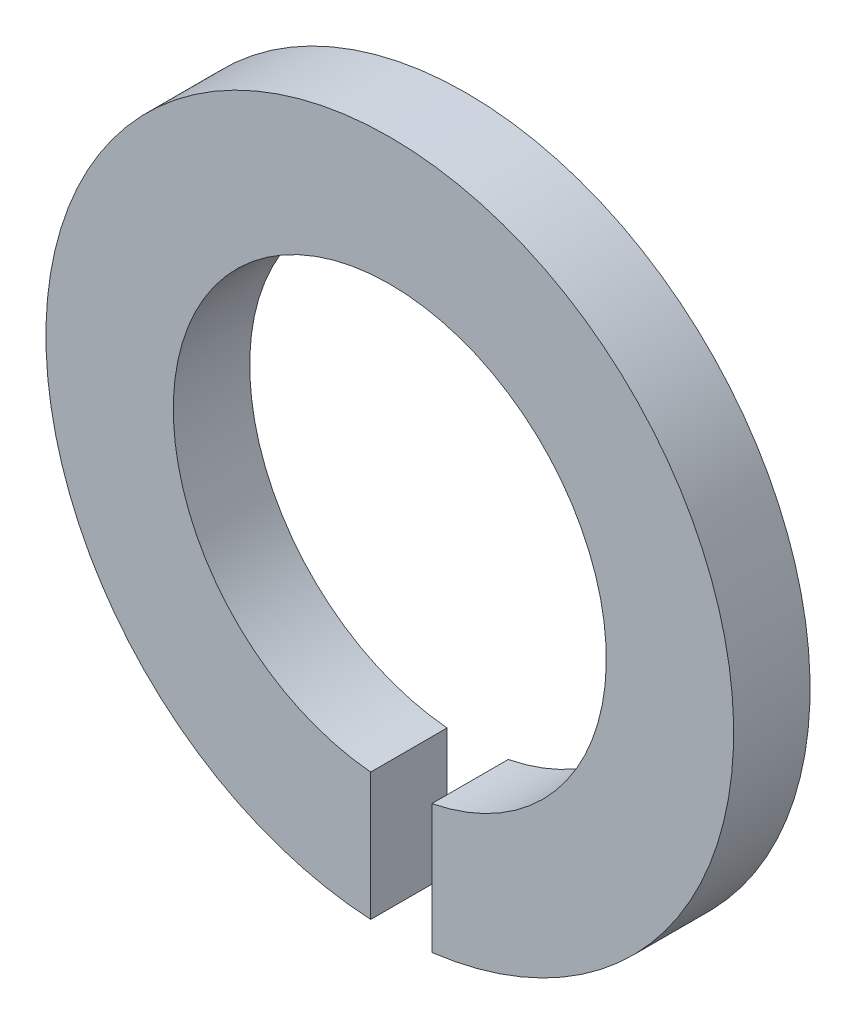
ISO-10303-21;
HEADER;
FILE_DESCRIPTION(('STEP AP214'),'2;1');
FILE_NAME('part.step','',(''),(''),'','','');
FILE_SCHEMA(('AUTOMOTIVE_DESIGN { 1 0 10303 214 1 1 1 1 }'));
ENDSEC;
DATA;
#1=APPLICATION_CONTEXT('core data for automotive mechanical design processes');
#2=APPLICATION_PROTOCOL_DEFINITION('international standard','automotive_design',2000,#1);
#3=PRODUCT_CONTEXT('',#1,'mechanical');
#4=PRODUCT('Part','Part','',(#3));
#5=PRODUCT_RELATED_PRODUCT_CATEGORY('part','',(#4));
#6=PRODUCT_DEFINITION_FORMATION('','',#4);
#7=PRODUCT_DEFINITION_CONTEXT('part definition',#1,'design');
#8=PRODUCT_DEFINITION('design','',#6,#7);
#9=PRODUCT_DEFINITION_SHAPE('','',#8);
#10=(LENGTH_UNIT() NAMED_UNIT(*) SI_UNIT(.MILLI.,.METRE.));
#11=(NAMED_UNIT(*) PLANE_ANGLE_UNIT() SI_UNIT($,.RADIAN.));
#12=(NAMED_UNIT(*) SI_UNIT($,.STERADIAN.) SOLID_ANGLE_UNIT());
#13=UNCERTAINTY_MEASURE_WITH_UNIT(LENGTH_MEASURE(1.E-05),#10,'distance_accuracy_value','');
#14=(GEOMETRIC_REPRESENTATION_CONTEXT(3) GLOBAL_UNCERTAINTY_ASSIGNED_CONTEXT((#13)) GLOBAL_UNIT_ASSIGNED_CONTEXT((#10,
#11,#12)) REPRESENTATION_CONTEXT('',''));
#15=CARTESIAN_POINT('',(0.,0.,0.));
#16=DIRECTION('',(0.,0.,1.));
#17=DIRECTION('',(1.,0.,0.));
#18=AXIS2_PLACEMENT_3D('',#15,#16,#17);
#19=CARTESIAN_POINT('',(0.,0.,-0.6));
#20=DIRECTION('',(0.,0.,1.));
#21=DIRECTION('',(1.,0.,0.));
#22=AXIS2_PLACEMENT_3D('',#19,#20,#21);
#23=PLANE('',#22);
#24=CARTESIAN_POINT('',(0.,0.,-0.6));
#25=DIRECTION('',(0.,0.,1.));
#26=DIRECTION('',(1.,0.,0.));
#27=AXIS2_PLACEMENT_3D('',#24,#25,#26);
#28=CIRCLE('',#27,1.7);
#29=CARTESIAN_POINT('',(0.33,-1.66766303550807,-0.6));
#30=VERTEX_POINT('',#29);
#31=CARTESIAN_POINT('',(-0.15,-1.69336942218761,-0.6));
#32=VERTEX_POINT('',#31);
#33=EDGE_CURVE('E20',#30,#32,#28,.T.);
#34=ORIENTED_EDGE('',*,*,#33,.T.);
#35=DIRECTION('',(0.,1.,0.));
#36=VECTOR('',#35,1.);
#37=CARTESIAN_POINT('',(-0.15,-2.7,-0.6));
#38=LINE('',#37,#36);
#39=CARTESIAN_POINT('',(-0.15,-2.69583011334171,-0.6));
#40=VERTEX_POINT('',#39);
#41=EDGE_CURVE('E66',#32,#40,#38,.F.);
#42=ORIENTED_EDGE('',*,*,#41,.T.);
#43=CARTESIAN_POINT('',(0.,0.,-0.6));
#44=DIRECTION('',(0.,0.,1.));
#45=DIRECTION('',(1.,0.,0.));
#46=AXIS2_PLACEMENT_3D('',#43,#44,#45);
#47=CIRCLE('',#46,2.7);
#48=CARTESIAN_POINT('',(0.33,-2.67975745171088,-0.6));
#49=VERTEX_POINT('',#48);
#50=EDGE_CURVE('E98',#49,#40,#47,.T.);
#51=ORIENTED_EDGE('',*,*,#50,.F.);
#52=DIRECTION('',(0.,1.,0.));
#53=VECTOR('',#52,1.);
#54=CARTESIAN_POINT('',(0.33,-2.7,-0.6));
#55=LINE('',#54,#53);
#56=EDGE_CURVE('E62',#49,#30,#55,.T.);
#57=ORIENTED_EDGE('',*,*,#56,.T.);
#58=EDGE_LOOP('',(#34,#42,#51,#57));
#59=FACE_BOUND('',#58,.T.);
#60=ADVANCED_FACE('F17',(#59),#23,.F.);
#61=CARTESIAN_POINT('',(-0.15,-2.7,0.));
#62=DIRECTION('',(-1.,0.,0.));
#63=DIRECTION('',(0.,0.,1.));
#64=AXIS2_PLACEMENT_3D('',#61,#62,#63);
#65=PLANE('',#64);
#66=ORIENTED_EDGE('',*,*,#41,.F.);
#67=DIRECTION('',(0.,0.,1.));
#68=VECTOR('',#67,1.);
#69=CARTESIAN_POINT('',(-0.15,-1.69336942218761,-0.6));
#70=LINE('',#69,#68);
#71=CARTESIAN_POINT('',(-0.15,-1.69336942218761,0.));
#72=VERTEX_POINT('',#71);
#73=EDGE_CURVE('E73',#32,#72,#70,.T.);
#74=ORIENTED_EDGE('',*,*,#73,.T.);
#75=DIRECTION('',(0.,1.,0.));
#76=VECTOR('',#75,1.);
#77=CARTESIAN_POINT('',(-0.15,0.,0.));
#78=LINE('',#77,#76);
#79=CARTESIAN_POINT('',(-0.15,-2.69583011334171,0.));
#80=VERTEX_POINT('',#79);
#81=EDGE_CURVE('E97',#80,#72,#78,.T.);
#82=ORIENTED_EDGE('',*,*,#81,.F.);
#83=DIRECTION('',(0.,0.,1.));
#84=VECTOR('',#83,1.);
#85=CARTESIAN_POINT('',(-0.15,-2.69583011334171,-0.6));
#86=LINE('',#85,#84);
#87=EDGE_CURVE('E79',#40,#80,#86,.T.);
#88=ORIENTED_EDGE('',*,*,#87,.F.);
#89=EDGE_LOOP('',(#66,#74,#82,#88));
#90=FACE_BOUND('',#89,.T.);
#91=ADVANCED_FACE('F75',(#90),#65,.F.);
#92=CARTESIAN_POINT('',(0.,0.,-0.6));
#93=DIRECTION('',(0.,0.,1.));
#94=DIRECTION('',(1.,0.,0.));
#95=AXIS2_PLACEMENT_3D('',#92,#93,#94);
#96=CYLINDRICAL_SURFACE('',#95,1.7);
#97=ORIENTED_EDGE('',*,*,#33,.F.);
#98=DIRECTION('',(0.,0.,-1.));
#99=VECTOR('',#98,1.);
#100=CARTESIAN_POINT('',(0.33,-1.66766303550807,0.));
#101=LINE('',#100,#99);
#102=CARTESIAN_POINT('',(0.33,-1.66766303550807,0.));
#103=VERTEX_POINT('',#102);
#104=EDGE_CURVE('E92',#30,#103,#101,.F.);
#105=ORIENTED_EDGE('',*,*,#104,.T.);
#106=CARTESIAN_POINT('',(0.,0.,0.));
#107=DIRECTION('',(0.,0.,1.));
#108=DIRECTION('',(1.,0.,0.));
#109=AXIS2_PLACEMENT_3D('',#106,#107,#108);
#110=CIRCLE('',#109,1.7);
#111=EDGE_CURVE('E84',#72,#103,#110,.F.);
#112=ORIENTED_EDGE('',*,*,#111,.F.);
#113=ORIENTED_EDGE('',*,*,#73,.F.);
#114=EDGE_LOOP('',(#97,#105,#112,#113));
#115=FACE_BOUND('',#114,.T.);
#116=ADVANCED_FACE('F83',(#115),#96,.F.);
#117=CARTESIAN_POINT('',(0.33,-2.7,0.));
#118=DIRECTION('',(1.,0.,0.));
#119=DIRECTION('',(0.,0.,-1.));
#120=AXIS2_PLACEMENT_3D('',#117,#118,#119);
#121=PLANE('',#120);
#122=DIRECTION('',(0.,1.,0.));
#123=VECTOR('',#122,1.);
#124=CARTESIAN_POINT('',(0.33,0.,0.));
#125=LINE('',#124,#123);
#126=CARTESIAN_POINT('',(0.33,-2.67975745171088,0.));
#127=VERTEX_POINT('',#126);
#128=EDGE_CURVE('E27',#103,#127,#125,.F.);
#129=ORIENTED_EDGE('',*,*,#128,.F.);
#130=ORIENTED_EDGE('',*,*,#104,.F.);
#131=ORIENTED_EDGE('',*,*,#56,.F.);
#132=DIRECTION('',(0.,0.,1.));
#133=VECTOR('',#132,1.);
#134=CARTESIAN_POINT('',(0.33,-2.67975745171088,-0.6));
#135=LINE('',#134,#133);
#136=EDGE_CURVE('E39',#127,#49,#135,.F.);
#137=ORIENTED_EDGE('',*,*,#136,.F.);
#138=EDGE_LOOP('',(#129,#130,#131,#137));
#139=FACE_BOUND('',#138,.T.);
#140=ADVANCED_FACE('F111',(#139),#121,.F.);
#141=CARTESIAN_POINT('',(0.,0.,-0.6));
#142=DIRECTION('',(0.,0.,1.));
#143=DIRECTION('',(1.,0.,0.));
#144=AXIS2_PLACEMENT_3D('',#141,#142,#143);
#145=CYLINDRICAL_SURFACE('',#144,2.7);
#146=ORIENTED_EDGE('',*,*,#87,.T.);
#147=CARTESIAN_POINT('',(0.,0.,0.));
#148=DIRECTION('',(0.,0.,1.));
#149=DIRECTION('',(1.,0.,0.));
#150=AXIS2_PLACEMENT_3D('',#147,#148,#149);
#151=CIRCLE('',#150,2.7);
#152=EDGE_CURVE('E11',#127,#80,#151,.T.);
#153=ORIENTED_EDGE('',*,*,#152,.F.);
#154=ORIENTED_EDGE('',*,*,#136,.T.);
#155=ORIENTED_EDGE('',*,*,#50,.T.);
#156=EDGE_LOOP('',(#146,#153,#154,#155));
#157=FACE_BOUND('',#156,.T.);
#158=ADVANCED_FACE('F113',(#157),#145,.T.);
#159=CARTESIAN_POINT('',(0.,0.,0.));
#160=DIRECTION('',(0.,0.,1.));
#161=DIRECTION('',(1.,0.,0.));
#162=AXIS2_PLACEMENT_3D('',#159,#160,#161);
#163=PLANE('',#162);
#164=ORIENTED_EDGE('',*,*,#152,.T.);
#165=ORIENTED_EDGE('',*,*,#81,.T.);
#166=ORIENTED_EDGE('',*,*,#111,.T.);
#167=ORIENTED_EDGE('',*,*,#128,.T.);
#168=EDGE_LOOP('',(#164,#165,#166,#167));
#169=FACE_BOUND('',#168,.T.);
#170=ADVANCED_FACE('F110',(#169),#163,.T.);
#171=CLOSED_SHELL('',(#60,#91,#116,#140,#158,#170));
#172=MANIFOLD_SOLID_BREP('B1',#171);
#173=ADVANCED_BREP_SHAPE_REPRESENTATION('',(#18,#172),#14);
#174=SHAPE_DEFINITION_REPRESENTATION(#9,#173);
ENDSEC;
END-ISO-10303-21;
